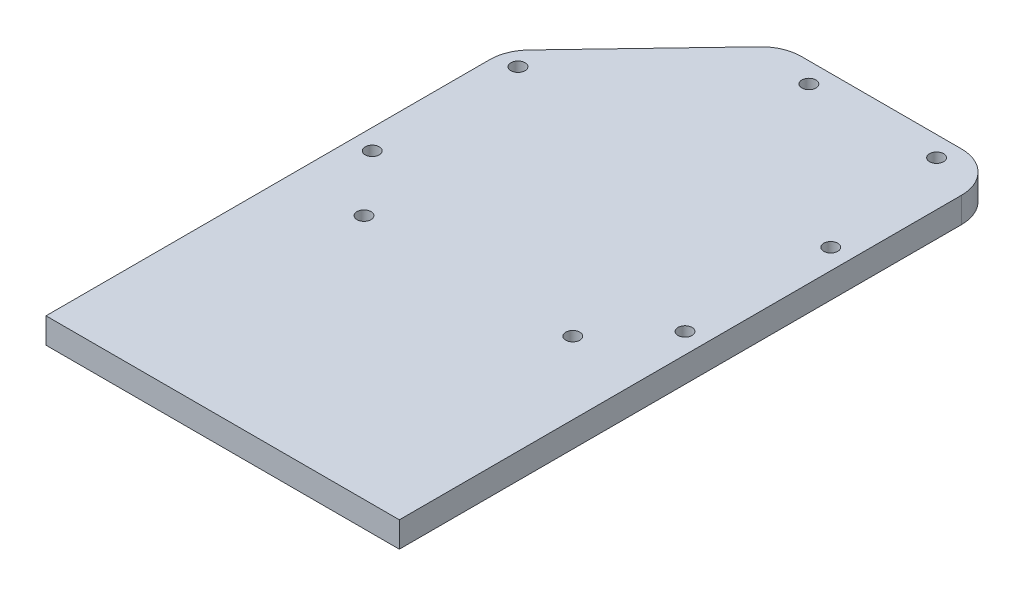
ISO-10303-21;
HEADER;
FILE_DESCRIPTION(('STEP AP214'),'2;1');
FILE_NAME('part.step','',(''),(''),'','','');
FILE_SCHEMA(('AUTOMOTIVE_DESIGN { 1 0 10303 214 1 1 1 1 }'));
ENDSEC;
DATA;
#1=APPLICATION_CONTEXT('core data for automotive mechanical design processes');
#2=APPLICATION_PROTOCOL_DEFINITION('international standard','automotive_design',2000,#1);
#3=PRODUCT_CONTEXT('',#1,'mechanical');
#4=PRODUCT('Part','Part','',(#3));
#5=PRODUCT_RELATED_PRODUCT_CATEGORY('part','',(#4));
#6=PRODUCT_DEFINITION_FORMATION('','',#4);
#7=PRODUCT_DEFINITION_CONTEXT('part definition',#1,'design');
#8=PRODUCT_DEFINITION('design','',#6,#7);
#9=PRODUCT_DEFINITION_SHAPE('','',#8);
#10=(LENGTH_UNIT() NAMED_UNIT(*) SI_UNIT(.MILLI.,.METRE.));
#11=(NAMED_UNIT(*) PLANE_ANGLE_UNIT() SI_UNIT($,.RADIAN.));
#12=(NAMED_UNIT(*) SI_UNIT($,.STERADIAN.) SOLID_ANGLE_UNIT());
#13=UNCERTAINTY_MEASURE_WITH_UNIT(LENGTH_MEASURE(1.E-05),#10,'distance_accuracy_value','');
#14=(GEOMETRIC_REPRESENTATION_CONTEXT(3) GLOBAL_UNCERTAINTY_ASSIGNED_CONTEXT((#13)) GLOBAL_UNIT_ASSIGNED_CONTEXT((#10,
#11,#12)) REPRESENTATION_CONTEXT('',''));
#15=CARTESIAN_POINT('',(0.,0.,0.));
#16=DIRECTION('',(0.,0.,1.));
#17=DIRECTION('',(1.,0.,0.));
#18=AXIS2_PLACEMENT_3D('',#15,#16,#17);
#19=CARTESIAN_POINT('',(0.,0.,-150.));
#20=DIRECTION('',(0.,0.,1.));
#21=DIRECTION('',(1.,0.,0.));
#22=AXIS2_PLACEMENT_3D('',#19,#20,#21);
#23=PLANE('',#22);
#24=DIRECTION('',(1.,0.,0.));
#25=VECTOR('',#24,1.);
#26=CARTESIAN_POINT('',(0.,6.35,-150.));
#27=LINE('',#26,#25);
#28=CARTESIAN_POINT('',(0.,6.35,-150.));
#29=VERTEX_POINT('',#28);
#30=CARTESIAN_POINT('',(88.,6.35,-150.));
#31=VERTEX_POINT('',#30);
#32=EDGE_CURVE('E171',#29,#31,#27,.T.);
#33=ORIENTED_EDGE('',*,*,#32,.F.);
#34=DIRECTION('',(0.,1.,0.));
#35=VECTOR('',#34,1.);
#36=CARTESIAN_POINT('',(0.,6.35,-150.));
#37=LINE('',#36,#35);
#38=CARTESIAN_POINT('',(0.,0.,-150.));
#39=VERTEX_POINT('',#38);
#40=EDGE_CURVE('E123',#39,#29,#37,.T.);
#41=ORIENTED_EDGE('',*,*,#40,.F.);
#42=DIRECTION('',(1.,0.,0.));
#43=VECTOR('',#42,1.);
#44=CARTESIAN_POINT('',(0.,0.,-150.));
#45=LINE('',#44,#43);
#46=CARTESIAN_POINT('',(88.,0.,-150.));
#47=VERTEX_POINT('',#46);
#48=EDGE_CURVE('E110',#39,#47,#45,.T.);
#49=ORIENTED_EDGE('',*,*,#48,.T.);
#50=DIRECTION('',(0.,1.,0.));
#51=VECTOR('',#50,1.);
#52=CARTESIAN_POINT('',(88.,6.35,-150.));
#53=LINE('',#52,#51);
#54=EDGE_CURVE('E119',#47,#31,#53,.T.);
#55=ORIENTED_EDGE('',*,*,#54,.T.);
#56=EDGE_LOOP('',(#33,#41,#49,#55));
#57=FACE_BOUND('',#56,.T.);
#58=ADVANCED_FACE('F38',(#57),#23,.T.);
#59=CARTESIAN_POINT('',(0.,6.35,0.));
#60=DIRECTION('',(-1.,0.,0.));
#61=DIRECTION('',(0.,0.,1.));
#62=AXIS2_PLACEMENT_3D('',#59,#60,#61);
#63=PLANE('',#62);
#64=DIRECTION('',(0.,0.,-1.));
#65=VECTOR('',#64,1.);
#66=CARTESIAN_POINT('',(0.,0.,0.));
#67=LINE('',#66,#65);
#68=CARTESIAN_POINT('',(0.,0.,-260.519578553112));
#69=VERTEX_POINT('',#68);
#70=EDGE_CURVE('E42',#39,#69,#67,.T.);
#71=ORIENTED_EDGE('',*,*,#70,.F.);
#72=ORIENTED_EDGE('',*,*,#40,.T.);
#73=DIRECTION('',(0.,0.,-1.));
#74=VECTOR('',#73,1.);
#75=CARTESIAN_POINT('',(0.,6.35,0.));
#76=LINE('',#75,#74);
#77=CARTESIAN_POINT('',(0.,6.35,-260.519578553112));
#78=VERTEX_POINT('',#77);
#79=EDGE_CURVE('E131',#29,#78,#76,.T.);
#80=ORIENTED_EDGE('',*,*,#79,.T.);
#81=DIRECTION('',(0.,-1.,0.));
#82=VECTOR('',#81,1.);
#83=CARTESIAN_POINT('',(0.,0.,-260.519578553112));
#84=LINE('',#83,#82);
#85=EDGE_CURVE('E181',#78,#69,#84,.T.);
#86=ORIENTED_EDGE('',*,*,#85,.T.);
#87=EDGE_LOOP('',(#71,#72,#80,#86));
#88=FACE_BOUND('',#87,.T.);
#89=ADVANCED_FACE('F173',(#88),#63,.T.);
#90=CARTESIAN_POINT('',(88.,6.35,0.));
#91=DIRECTION('',(-1.,0.,0.));
#92=DIRECTION('',(0.,0.,1.));
#93=AXIS2_PLACEMENT_3D('',#90,#91,#92);
#94=PLANE('',#93);
#95=ORIENTED_EDGE('',*,*,#54,.F.);
#96=DIRECTION('',(0.,0.,-1.));
#97=VECTOR('',#96,1.);
#98=CARTESIAN_POINT('',(88.,0.,0.));
#99=LINE('',#98,#97);
#100=CARTESIAN_POINT('',(88.,0.,-290.));
#101=VERTEX_POINT('',#100);
#102=EDGE_CURVE('E106',#47,#101,#99,.T.);
#103=ORIENTED_EDGE('',*,*,#102,.T.);
#104=DIRECTION('',(0.,-1.,0.));
#105=VECTOR('',#104,1.);
#106=CARTESIAN_POINT('',(88.,6.35,-290.));
#107=LINE('',#106,#105);
#108=CARTESIAN_POINT('',(88.,6.35,-290.));
#109=VERTEX_POINT('',#108);
#110=EDGE_CURVE('E172',#101,#109,#107,.F.);
#111=ORIENTED_EDGE('',*,*,#110,.T.);
#112=DIRECTION('',(0.,0.,-1.));
#113=VECTOR('',#112,1.);
#114=CARTESIAN_POINT('',(88.,6.35,0.));
#115=LINE('',#114,#113);
#116=EDGE_CURVE('E121',#31,#109,#115,.T.);
#117=ORIENTED_EDGE('',*,*,#116,.F.);
#118=EDGE_LOOP('',(#95,#103,#111,#117));
#119=FACE_BOUND('',#118,.T.);
#120=ADVANCED_FACE('F120',(#119),#94,.F.);
#121=CARTESIAN_POINT('',(0.,6.35,0.));
#122=DIRECTION('',(0.,1.,0.));
#123=DIRECTION('',(0.,0.,1.));
#124=AXIS2_PLACEMENT_3D('',#121,#122,#123);
#125=PLANE('',#124);
#126=CARTESIAN_POINT('',(18.,6.35,-211.2));
#127=DIRECTION('',(0.,1.,0.));
#128=DIRECTION('',(0.,0.,1.));
#129=AXIS2_PLACEMENT_3D('',#126,#127,#128);
#130=CIRCLE('',#129,1.75);
#131=CARTESIAN_POINT('',(18.,6.35,-209.45));
#132=VERTEX_POINT('',#131);
#133=EDGE_CURVE('E145',#132,#132,#130,.T.);
#134=ORIENTED_EDGE('',*,*,#133,.F.);
#135=EDGE_LOOP('',(#134));
#136=FACE_BOUND('',#135,.T.);
#137=CARTESIAN_POINT('',(70.,6.35,-211.2));
#138=DIRECTION('',(0.,1.,0.));
#139=DIRECTION('',(0.,0.,1.));
#140=AXIS2_PLACEMENT_3D('',#137,#138,#139);
#141=CIRCLE('',#140,1.75);
#142=CARTESIAN_POINT('',(70.,6.35,-209.45));
#143=VERTEX_POINT('',#142);
#144=EDGE_CURVE('E151',#143,#143,#141,.T.);
#145=ORIENTED_EDGE('',*,*,#144,.F.);
#146=EDGE_LOOP('',(#145));
#147=FACE_BOUND('',#146,.T.);
#148=CARTESIAN_POINT('',(5.05,6.35,-262.5));
#149=DIRECTION('',(0.,1.,0.));
#150=DIRECTION('',(0.,0.,1.));
#151=AXIS2_PLACEMENT_3D('',#148,#149,#150);
#152=CIRCLE('',#151,1.75);
#153=CARTESIAN_POINT('',(5.05,6.35,-260.75));
#154=VERTEX_POINT('',#153);
#155=EDGE_CURVE('E154',#154,#154,#152,.T.);
#156=ORIENTED_EDGE('',*,*,#155,.F.);
#157=EDGE_LOOP('',(#156));
#158=FACE_BOUND('',#157,.T.);
#159=CARTESIAN_POINT('',(5.05,6.35,-226.2));
#160=DIRECTION('',(0.,1.,0.));
#161=DIRECTION('',(0.,0.,1.));
#162=AXIS2_PLACEMENT_3D('',#159,#160,#161);
#163=CIRCLE('',#162,1.75);
#164=CARTESIAN_POINT('',(5.05,6.35,-224.45));
#165=VERTEX_POINT('',#164);
#166=EDGE_CURVE('E157',#165,#165,#163,.T.);
#167=ORIENTED_EDGE('',*,*,#166,.F.);
#168=EDGE_LOOP('',(#167));
#169=FACE_BOUND('',#168,.T.);
#170=CARTESIAN_POINT('',(82.95,6.35,-226.2));
#171=DIRECTION('',(0.,1.,0.));
#172=DIRECTION('',(0.,0.,1.));
#173=AXIS2_PLACEMENT_3D('',#170,#171,#172);
#174=CIRCLE('',#173,1.75);
#175=CARTESIAN_POINT('',(82.95,6.35,-224.45));
#176=VERTEX_POINT('',#175);
#177=EDGE_CURVE('E160',#176,#176,#174,.T.);
#178=ORIENTED_EDGE('',*,*,#177,.F.);
#179=EDGE_LOOP('',(#178));
#180=FACE_BOUND('',#179,.T.);
#181=CARTESIAN_POINT('',(82.95,6.35,-262.5));
#182=DIRECTION('',(0.,1.,0.));
#183=DIRECTION('',(0.,0.,1.));
#184=AXIS2_PLACEMENT_3D('',#181,#182,#183);
#185=CIRCLE('',#184,1.75);
#186=CARTESIAN_POINT('',(82.95,6.35,-260.75));
#187=VERTEX_POINT('',#186);
#188=EDGE_CURVE('E163',#187,#187,#185,.T.);
#189=ORIENTED_EDGE('',*,*,#188,.F.);
#190=EDGE_LOOP('',(#189));
#191=FACE_BOUND('',#190,.T.);
#192=CARTESIAN_POINT('',(45.,6.35,-295.));
#193=DIRECTION('',(0.,1.,0.));
#194=DIRECTION('',(0.,0.,1.));
#195=AXIS2_PLACEMENT_3D('',#192,#193,#194);
#196=CIRCLE('',#195,1.75);
#197=CARTESIAN_POINT('',(45.,6.35,-293.25));
#198=VERTEX_POINT('',#197);
#199=EDGE_CURVE('E166',#198,#198,#196,.T.);
#200=ORIENTED_EDGE('',*,*,#199,.F.);
#201=EDGE_LOOP('',(#200));
#202=FACE_BOUND('',#201,.T.);
#203=CARTESIAN_POINT('',(76.8,6.35,-295.));
#204=DIRECTION('',(0.,1.,0.));
#205=DIRECTION('',(0.,0.,1.));
#206=AXIS2_PLACEMENT_3D('',#203,#204,#205);
#207=CIRCLE('',#206,1.75);
#208=CARTESIAN_POINT('',(76.8,6.35,-293.25));
#209=VERTEX_POINT('',#208);
#210=EDGE_CURVE('E116',#209,#209,#207,.T.);
#211=ORIENTED_EDGE('',*,*,#210,.F.);
#212=EDGE_LOOP('',(#211));
#213=FACE_BOUND('',#212,.T.);
#214=ORIENTED_EDGE('',*,*,#79,.F.);
#215=ORIENTED_EDGE('',*,*,#32,.T.);
#216=ORIENTED_EDGE('',*,*,#116,.T.);
#217=CARTESIAN_POINT('',(78.,6.35,-290.));
#218=DIRECTION('',(0.,1.,0.));
#219=DIRECTION('',(0.,0.,1.));
#220=AXIS2_PLACEMENT_3D('',#217,#218,#219);
#221=CIRCLE('',#220,10.);
#222=CARTESIAN_POINT('',(78.,6.35,-300.));
#223=VERTEX_POINT('',#222);
#224=EDGE_CURVE('E178',#109,#223,#221,.T.);
#225=ORIENTED_EDGE('',*,*,#224,.T.);
#226=DIRECTION('',(1.,0.,0.));
#227=VECTOR('',#226,1.);
#228=CARTESIAN_POINT('',(0.,6.35,-300.));
#229=LINE('',#228,#227);
#230=CARTESIAN_POINT('',(38.0848455550211,6.35,-300.));
#231=VERTEX_POINT('',#230);
#232=EDGE_CURVE('E139',#231,#223,#229,.T.);
#233=ORIENTED_EDGE('',*,*,#232,.F.);
#234=CARTESIAN_POINT('',(38.0848455550211,6.35,-290.));
#235=DIRECTION('',(0.,1.,0.));
#236=DIRECTION('',(0.,0.,1.));
#237=AXIS2_PLACEMENT_3D('',#234,#235,#236);
#238=CIRCLE('',#237,10.);
#239=CARTESIAN_POINT('',(30.8444786685357,6.35,-296.897614612972));
#240=VERTEX_POINT('',#239);
#241=EDGE_CURVE('E179',#231,#240,#238,.T.);
#242=ORIENTED_EDGE('',*,*,#241,.T.);
#243=DIRECTION('',(-0.689761461297211,0.,0.724036688648535));
#244=VECTOR('',#243,1.);
#245=CARTESIAN_POINT('',(-132.104836842493,6.35,-125.851116018708));
#246=LINE('',#245,#244);
#247=CARTESIAN_POINT('',(2.75963311351465,6.35,-267.417193166084));
#248=VERTEX_POINT('',#247);
#249=EDGE_CURVE('E133',#240,#248,#246,.T.);
#250=ORIENTED_EDGE('',*,*,#249,.T.);
#251=CARTESIAN_POINT('',(10.,6.35,-260.519578553112));
#252=DIRECTION('',(0.,1.,0.));
#253=DIRECTION('',(0.,0.,1.));
#254=AXIS2_PLACEMENT_3D('',#251,#252,#253);
#255=CIRCLE('',#254,10.);
#256=EDGE_CURVE('E174',#248,#78,#255,.T.);
#257=ORIENTED_EDGE('',*,*,#256,.T.);
#258=EDGE_LOOP('',(#214,#215,#216,#225,#233,#242,#250,#257));
#259=FACE_BOUND('',#258,.T.);
#260=ADVANCED_FACE('F40',(#136,#147,#158,#169,#180,#191,#202,#213,#259),#125,.T.);
#261=CARTESIAN_POINT('',(0.,0.,0.));
#262=DIRECTION('',(0.,1.,0.));
#263=DIRECTION('',(0.,0.,1.));
#264=AXIS2_PLACEMENT_3D('',#261,#262,#263);
#265=PLANE('',#264);
#266=CARTESIAN_POINT('',(18.,0.,-211.2));
#267=DIRECTION('',(0.,1.,0.));
#268=DIRECTION('',(0.,0.,1.));
#269=AXIS2_PLACEMENT_3D('',#266,#267,#268);
#270=CIRCLE('',#269,1.75);
#271=CARTESIAN_POINT('',(18.,0.,-209.45));
#272=VERTEX_POINT('',#271);
#273=EDGE_CURVE('E203',#272,#272,#270,.T.);
#274=ORIENTED_EDGE('',*,*,#273,.T.);
#275=EDGE_LOOP('',(#274));
#276=FACE_BOUND('',#275,.T.);
#277=CARTESIAN_POINT('',(70.,0.,-211.2));
#278=DIRECTION('',(0.,1.,0.));
#279=DIRECTION('',(0.,0.,1.));
#280=AXIS2_PLACEMENT_3D('',#277,#278,#279);
#281=CIRCLE('',#280,1.75);
#282=CARTESIAN_POINT('',(70.,0.,-209.45));
#283=VERTEX_POINT('',#282);
#284=EDGE_CURVE('E206',#283,#283,#281,.T.);
#285=ORIENTED_EDGE('',*,*,#284,.T.);
#286=EDGE_LOOP('',(#285));
#287=FACE_BOUND('',#286,.T.);
#288=CARTESIAN_POINT('',(5.05,0.,-262.5));
#289=DIRECTION('',(0.,1.,0.));
#290=DIRECTION('',(0.,0.,1.));
#291=AXIS2_PLACEMENT_3D('',#288,#289,#290);
#292=CIRCLE('',#291,1.75);
#293=CARTESIAN_POINT('',(5.05,0.,-260.75));
#294=VERTEX_POINT('',#293);
#295=EDGE_CURVE('E209',#294,#294,#292,.T.);
#296=ORIENTED_EDGE('',*,*,#295,.T.);
#297=EDGE_LOOP('',(#296));
#298=FACE_BOUND('',#297,.T.);
#299=CARTESIAN_POINT('',(5.05,0.,-226.2));
#300=DIRECTION('',(0.,1.,0.));
#301=DIRECTION('',(0.,0.,1.));
#302=AXIS2_PLACEMENT_3D('',#299,#300,#301);
#303=CIRCLE('',#302,1.75);
#304=CARTESIAN_POINT('',(5.05,0.,-224.45));
#305=VERTEX_POINT('',#304);
#306=EDGE_CURVE('E212',#305,#305,#303,.T.);
#307=ORIENTED_EDGE('',*,*,#306,.T.);
#308=EDGE_LOOP('',(#307));
#309=FACE_BOUND('',#308,.T.);
#310=CARTESIAN_POINT('',(82.95,0.,-226.2));
#311=DIRECTION('',(0.,1.,0.));
#312=DIRECTION('',(0.,0.,1.));
#313=AXIS2_PLACEMENT_3D('',#310,#311,#312);
#314=CIRCLE('',#313,1.75);
#315=CARTESIAN_POINT('',(82.95,0.,-224.45));
#316=VERTEX_POINT('',#315);
#317=EDGE_CURVE('E215',#316,#316,#314,.T.);
#318=ORIENTED_EDGE('',*,*,#317,.T.);
#319=EDGE_LOOP('',(#318));
#320=FACE_BOUND('',#319,.T.);
#321=CARTESIAN_POINT('',(82.95,0.,-262.5));
#322=DIRECTION('',(0.,1.,0.));
#323=DIRECTION('',(0.,0.,1.));
#324=AXIS2_PLACEMENT_3D('',#321,#322,#323);
#325=CIRCLE('',#324,1.75);
#326=CARTESIAN_POINT('',(82.95,0.,-260.75));
#327=VERTEX_POINT('',#326);
#328=EDGE_CURVE('E218',#327,#327,#325,.T.);
#329=ORIENTED_EDGE('',*,*,#328,.T.);
#330=EDGE_LOOP('',(#329));
#331=FACE_BOUND('',#330,.T.);
#332=CARTESIAN_POINT('',(45.,0.,-295.));
#333=DIRECTION('',(0.,1.,0.));
#334=DIRECTION('',(0.,0.,1.));
#335=AXIS2_PLACEMENT_3D('',#332,#333,#334);
#336=CIRCLE('',#335,1.75);
#337=CARTESIAN_POINT('',(45.,0.,-293.25));
#338=VERTEX_POINT('',#337);
#339=EDGE_CURVE('E47',#338,#338,#336,.T.);
#340=ORIENTED_EDGE('',*,*,#339,.T.);
#341=EDGE_LOOP('',(#340));
#342=FACE_BOUND('',#341,.T.);
#343=CARTESIAN_POINT('',(76.8,0.,-295.));
#344=DIRECTION('',(0.,1.,0.));
#345=DIRECTION('',(0.,0.,1.));
#346=AXIS2_PLACEMENT_3D('',#343,#344,#345);
#347=CIRCLE('',#346,1.75);
#348=CARTESIAN_POINT('',(76.8,0.,-293.25));
#349=VERTEX_POINT('',#348);
#350=EDGE_CURVE('E11',#349,#349,#347,.T.);
#351=ORIENTED_EDGE('',*,*,#350,.T.);
#352=EDGE_LOOP('',(#351));
#353=FACE_BOUND('',#352,.T.);
#354=ORIENTED_EDGE('',*,*,#48,.F.);
#355=ORIENTED_EDGE('',*,*,#70,.T.);
#356=CARTESIAN_POINT('',(10.,0.,-260.519578553112));
#357=DIRECTION('',(0.,1.,0.));
#358=DIRECTION('',(0.,0.,1.));
#359=AXIS2_PLACEMENT_3D('',#356,#357,#358);
#360=CIRCLE('',#359,10.);
#361=CARTESIAN_POINT('',(2.75963311351465,0.,-267.417193166084));
#362=VERTEX_POINT('',#361);
#363=EDGE_CURVE('E63',#69,#362,#360,.F.);
#364=ORIENTED_EDGE('',*,*,#363,.T.);
#365=DIRECTION('',(-0.689761461297211,0.,0.724036688648535));
#366=VECTOR('',#365,1.);
#367=CARTESIAN_POINT('',(-132.104836842493,0.,-125.851116018708));
#368=LINE('',#367,#366);
#369=CARTESIAN_POINT('',(30.8444786685357,0.,-296.897614612972));
#370=VERTEX_POINT('',#369);
#371=EDGE_CURVE('E199',#370,#362,#368,.T.);
#372=ORIENTED_EDGE('',*,*,#371,.F.);
#373=CARTESIAN_POINT('',(38.0848455550211,0.,-290.));
#374=DIRECTION('',(0.,1.,0.));
#375=DIRECTION('',(0.,0.,1.));
#376=AXIS2_PLACEMENT_3D('',#373,#374,#375);
#377=CIRCLE('',#376,10.);
#378=CARTESIAN_POINT('',(38.0848455550211,0.,-300.));
#379=VERTEX_POINT('',#378);
#380=EDGE_CURVE('E55',#370,#379,#377,.F.);
#381=ORIENTED_EDGE('',*,*,#380,.T.);
#382=DIRECTION('',(1.,0.,0.));
#383=VECTOR('',#382,1.);
#384=CARTESIAN_POINT('',(0.,0.,-300.));
#385=LINE('',#384,#383);
#386=CARTESIAN_POINT('',(78.,0.,-300.));
#387=VERTEX_POINT('',#386);
#388=EDGE_CURVE('E201',#379,#387,#385,.T.);
#389=ORIENTED_EDGE('',*,*,#388,.T.);
#390=CARTESIAN_POINT('',(78.,0.,-290.));
#391=DIRECTION('',(0.,1.,0.));
#392=DIRECTION('',(0.,0.,1.));
#393=AXIS2_PLACEMENT_3D('',#390,#391,#392);
#394=CIRCLE('',#393,10.);
#395=EDGE_CURVE('E112',#387,#101,#394,.F.);
#396=ORIENTED_EDGE('',*,*,#395,.T.);
#397=ORIENTED_EDGE('',*,*,#102,.F.);
#398=EDGE_LOOP('',(#354,#355,#364,#372,#381,#389,#396,#397));
#399=FACE_BOUND('',#398,.T.);
#400=ADVANCED_FACE('F108',(#276,#287,#298,#309,#320,#331,#342,#353,#399),#265,.F.);
#401=CARTESIAN_POINT('',(0.,6.35,-300.));
#402=DIRECTION('',(0.,0.,-1.));
#403=DIRECTION('',(-1.,0.,0.));
#404=AXIS2_PLACEMENT_3D('',#401,#402,#403);
#405=PLANE('',#404);
#406=ORIENTED_EDGE('',*,*,#388,.F.);
#407=DIRECTION('',(0.,-1.,0.));
#408=VECTOR('',#407,1.);
#409=CARTESIAN_POINT('',(38.0848455550211,6.35,-300.));
#410=LINE('',#409,#408);
#411=EDGE_CURVE('E188',#379,#231,#410,.F.);
#412=ORIENTED_EDGE('',*,*,#411,.T.);
#413=ORIENTED_EDGE('',*,*,#232,.T.);
#414=DIRECTION('',(0.,-1.,0.));
#415=VECTOR('',#414,1.);
#416=CARTESIAN_POINT('',(78.,0.,-300.));
#417=LINE('',#416,#415);
#418=EDGE_CURVE('E190',#223,#387,#417,.T.);
#419=ORIENTED_EDGE('',*,*,#418,.T.);
#420=EDGE_LOOP('',(#406,#412,#413,#419));
#421=FACE_BOUND('',#420,.T.);
#422=ADVANCED_FACE('F251',(#421),#405,.T.);
#423=CARTESIAN_POINT('',(-132.104836842493,6.35,-125.851116018708));
#424=DIRECTION('',(0.724036688648535,0.,0.689761461297211));
#425=DIRECTION('',(0.689761461297211,0.,-0.724036688648535));
#426=AXIS2_PLACEMENT_3D('',#423,#424,#425);
#427=PLANE('',#426);
#428=ORIENTED_EDGE('',*,*,#249,.F.);
#429=DIRECTION('',(0.,-1.,0.));
#430=VECTOR('',#429,1.);
#431=CARTESIAN_POINT('',(30.8444786685357,0.,-296.897614612972));
#432=LINE('',#431,#430);
#433=EDGE_CURVE('E196',#240,#370,#432,.T.);
#434=ORIENTED_EDGE('',*,*,#433,.T.);
#435=ORIENTED_EDGE('',*,*,#371,.T.);
#436=DIRECTION('',(0.,-1.,0.));
#437=VECTOR('',#436,1.);
#438=CARTESIAN_POINT('',(2.75963311351465,6.35,-267.417193166084));
#439=LINE('',#438,#437);
#440=EDGE_CURVE('E132',#362,#248,#439,.F.);
#441=ORIENTED_EDGE('',*,*,#440,.T.);
#442=EDGE_LOOP('',(#428,#434,#435,#441));
#443=FACE_BOUND('',#442,.T.);
#444=ADVANCED_FACE('F257',(#443),#427,.F.);
#445=CARTESIAN_POINT('',(18.,6.35,-211.2));
#446=DIRECTION('',(0.,-1.,0.));
#447=DIRECTION('',(0.,0.,-1.));
#448=AXIS2_PLACEMENT_3D('',#445,#446,#447);
#449=CYLINDRICAL_SURFACE('',#448,1.75);
#450=ORIENTED_EDGE('',*,*,#133,.T.);
#451=EDGE_LOOP('',(#450));
#452=FACE_BOUND('',#451,.T.);
#453=ORIENTED_EDGE('',*,*,#273,.F.);
#454=EDGE_LOOP('',(#453));
#455=FACE_BOUND('',#454,.T.);
#456=ADVANCED_FACE('F291',(#452,#455),#449,.F.);
#457=CARTESIAN_POINT('',(70.,6.35,-211.2));
#458=DIRECTION('',(0.,-1.,0.));
#459=DIRECTION('',(0.,0.,-1.));
#460=AXIS2_PLACEMENT_3D('',#457,#458,#459);
#461=CYLINDRICAL_SURFACE('',#460,1.75);
#462=ORIENTED_EDGE('',*,*,#144,.T.);
#463=EDGE_LOOP('',(#462));
#464=FACE_BOUND('',#463,.T.);
#465=ORIENTED_EDGE('',*,*,#284,.F.);
#466=EDGE_LOOP('',(#465));
#467=FACE_BOUND('',#466,.T.);
#468=ADVANCED_FACE('F287',(#464,#467),#461,.F.);
#469=CARTESIAN_POINT('',(5.05,6.35,-262.5));
#470=DIRECTION('',(0.,-1.,0.));
#471=DIRECTION('',(0.,0.,-1.));
#472=AXIS2_PLACEMENT_3D('',#469,#470,#471);
#473=CYLINDRICAL_SURFACE('',#472,1.75);
#474=ORIENTED_EDGE('',*,*,#155,.T.);
#475=EDGE_LOOP('',(#474));
#476=FACE_BOUND('',#475,.T.);
#477=ORIENTED_EDGE('',*,*,#295,.F.);
#478=EDGE_LOOP('',(#477));
#479=FACE_BOUND('',#478,.T.);
#480=ADVANCED_FACE('F281',(#476,#479),#473,.F.);
#481=CARTESIAN_POINT('',(5.05,6.35,-226.2));
#482=DIRECTION('',(0.,-1.,0.));
#483=DIRECTION('',(0.,0.,-1.));
#484=AXIS2_PLACEMENT_3D('',#481,#482,#483);
#485=CYLINDRICAL_SURFACE('',#484,1.75);
#486=ORIENTED_EDGE('',*,*,#166,.T.);
#487=EDGE_LOOP('',(#486));
#488=FACE_BOUND('',#487,.T.);
#489=ORIENTED_EDGE('',*,*,#306,.F.);
#490=EDGE_LOOP('',(#489));
#491=FACE_BOUND('',#490,.T.);
#492=ADVANCED_FACE('F275',(#488,#491),#485,.F.);
#493=CARTESIAN_POINT('',(82.95,6.35,-226.2));
#494=DIRECTION('',(0.,-1.,0.));
#495=DIRECTION('',(0.,0.,-1.));
#496=AXIS2_PLACEMENT_3D('',#493,#494,#495);
#497=CYLINDRICAL_SURFACE('',#496,1.75);
#498=ORIENTED_EDGE('',*,*,#177,.T.);
#499=EDGE_LOOP('',(#498));
#500=FACE_BOUND('',#499,.T.);
#501=ORIENTED_EDGE('',*,*,#317,.F.);
#502=EDGE_LOOP('',(#501));
#503=FACE_BOUND('',#502,.T.);
#504=ADVANCED_FACE('F238',(#500,#503),#497,.F.);
#505=CARTESIAN_POINT('',(82.95,6.35,-262.5));
#506=DIRECTION('',(0.,-1.,0.));
#507=DIRECTION('',(0.,0.,-1.));
#508=AXIS2_PLACEMENT_3D('',#505,#506,#507);
#509=CYLINDRICAL_SURFACE('',#508,1.75);
#510=ORIENTED_EDGE('',*,*,#188,.T.);
#511=EDGE_LOOP('',(#510));
#512=FACE_BOUND('',#511,.T.);
#513=ORIENTED_EDGE('',*,*,#328,.F.);
#514=EDGE_LOOP('',(#513));
#515=FACE_BOUND('',#514,.T.);
#516=ADVANCED_FACE('F228',(#512,#515),#509,.F.);
#517=CARTESIAN_POINT('',(45.,6.35,-295.));
#518=DIRECTION('',(0.,-1.,0.));
#519=DIRECTION('',(0.,0.,-1.));
#520=AXIS2_PLACEMENT_3D('',#517,#518,#519);
#521=CYLINDRICAL_SURFACE('',#520,1.75);
#522=ORIENTED_EDGE('',*,*,#199,.T.);
#523=EDGE_LOOP('',(#522));
#524=FACE_BOUND('',#523,.T.);
#525=ORIENTED_EDGE('',*,*,#339,.F.);
#526=EDGE_LOOP('',(#525));
#527=FACE_BOUND('',#526,.T.);
#528=ADVANCED_FACE('F225',(#524,#527),#521,.F.);
#529=CARTESIAN_POINT('',(76.8,6.35,-295.));
#530=DIRECTION('',(0.,-1.,0.));
#531=DIRECTION('',(0.,0.,-1.));
#532=AXIS2_PLACEMENT_3D('',#529,#530,#531);
#533=CYLINDRICAL_SURFACE('',#532,1.75);
#534=ORIENTED_EDGE('',*,*,#210,.T.);
#535=EDGE_LOOP('',(#534));
#536=FACE_BOUND('',#535,.T.);
#537=ORIENTED_EDGE('',*,*,#350,.F.);
#538=EDGE_LOOP('',(#537));
#539=FACE_BOUND('',#538,.T.);
#540=ADVANCED_FACE('F227',(#536,#539),#533,.F.);
#541=CARTESIAN_POINT('',(38.0848455550211,6.35,-290.));
#542=DIRECTION('',(0.,1.,0.));
#543=DIRECTION('',(0.,0.,1.));
#544=AXIS2_PLACEMENT_3D('',#541,#542,#543);
#545=CYLINDRICAL_SURFACE('',#544,10.);
#546=ORIENTED_EDGE('',*,*,#241,.F.);
#547=ORIENTED_EDGE('',*,*,#411,.F.);
#548=ORIENTED_EDGE('',*,*,#380,.F.);
#549=ORIENTED_EDGE('',*,*,#433,.F.);
#550=EDGE_LOOP('',(#546,#547,#548,#549));
#551=FACE_BOUND('',#550,.T.);
#552=ADVANCED_FACE('F235',(#551),#545,.T.);
#553=CARTESIAN_POINT('',(10.,6.35,-260.519578553112));
#554=DIRECTION('',(0.,1.,0.));
#555=DIRECTION('',(0.,0.,1.));
#556=AXIS2_PLACEMENT_3D('',#553,#554,#555);
#557=CYLINDRICAL_SURFACE('',#556,10.);
#558=ORIENTED_EDGE('',*,*,#256,.F.);
#559=ORIENTED_EDGE('',*,*,#440,.F.);
#560=ORIENTED_EDGE('',*,*,#363,.F.);
#561=ORIENTED_EDGE('',*,*,#85,.F.);
#562=EDGE_LOOP('',(#558,#559,#560,#561));
#563=FACE_BOUND('',#562,.T.);
#564=ADVANCED_FACE('F182',(#563),#557,.T.);
#565=CARTESIAN_POINT('',(78.,6.35,-290.));
#566=DIRECTION('',(0.,1.,0.));
#567=DIRECTION('',(0.,0.,1.));
#568=AXIS2_PLACEMENT_3D('',#565,#566,#567);
#569=CYLINDRICAL_SURFACE('',#568,10.);
#570=ORIENTED_EDGE('',*,*,#224,.F.);
#571=ORIENTED_EDGE('',*,*,#110,.F.);
#572=ORIENTED_EDGE('',*,*,#395,.F.);
#573=ORIENTED_EDGE('',*,*,#418,.F.);
#574=EDGE_LOOP('',(#570,#571,#572,#573));
#575=FACE_BOUND('',#574,.T.);
#576=ADVANCED_FACE('F249',(#575),#569,.T.);
#577=CLOSED_SHELL('',(#58,#89,#120,#260,#400,#422,#444,#456,#468,#480,#492,#504,#516,#528,#540,
#552,#564,#576));
#578=MANIFOLD_SOLID_BREP('B2',#577);
#579=ADVANCED_BREP_SHAPE_REPRESENTATION('',(#18,#578),#14);
#580=SHAPE_DEFINITION_REPRESENTATION(#9,#579);
ENDSEC;
END-ISO-10303-21;
